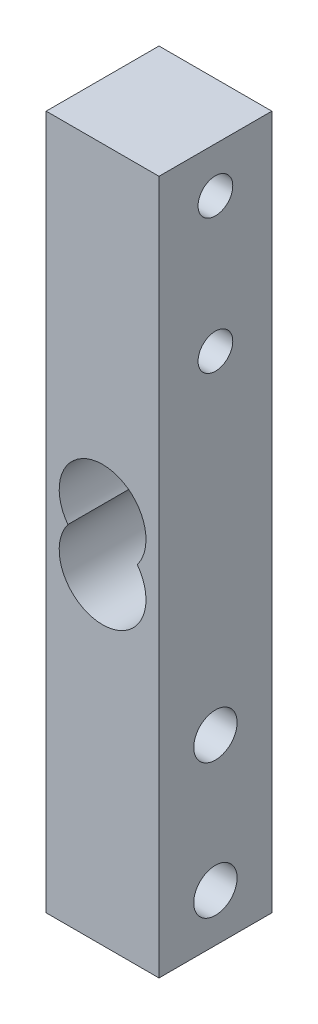
ISO-10303-21;
HEADER;
FILE_DESCRIPTION(('STEP AP214'),'2;1');
FILE_NAME('part.step','',(''),(''),'','','');
FILE_SCHEMA(('AUTOMOTIVE_DESIGN { 1 0 10303 214 1 1 1 1 }'));
ENDSEC;
DATA;
#1=APPLICATION_CONTEXT('core data for automotive mechanical design processes');
#2=APPLICATION_PROTOCOL_DEFINITION('international standard','automotive_design',2000,#1);
#3=PRODUCT_CONTEXT('',#1,'mechanical');
#4=PRODUCT('Part','Part','',(#3));
#5=PRODUCT_RELATED_PRODUCT_CATEGORY('part','',(#4));
#6=PRODUCT_DEFINITION_FORMATION('','',#4);
#7=PRODUCT_DEFINITION_CONTEXT('part definition',#1,'design');
#8=PRODUCT_DEFINITION('design','',#6,#7);
#9=PRODUCT_DEFINITION_SHAPE('','',#8);
#10=(LENGTH_UNIT() NAMED_UNIT(*) SI_UNIT(.MILLI.,.METRE.));
#11=(NAMED_UNIT(*) PLANE_ANGLE_UNIT() SI_UNIT($,.RADIAN.));
#12=(NAMED_UNIT(*) SI_UNIT($,.STERADIAN.) SOLID_ANGLE_UNIT());
#13=UNCERTAINTY_MEASURE_WITH_UNIT(LENGTH_MEASURE(1.E-05),#10,'distance_accuracy_value','');
#14=(GEOMETRIC_REPRESENTATION_CONTEXT(3) GLOBAL_UNCERTAINTY_ASSIGNED_CONTEXT((#13)) GLOBAL_UNIT_ASSIGNED_CONTEXT((#10,
#11,#12)) REPRESENTATION_CONTEXT('',''));
#15=CARTESIAN_POINT('',(0.,0.,0.));
#16=DIRECTION('',(0.,0.,1.));
#17=DIRECTION('',(1.,0.,0.));
#18=AXIS2_PLACEMENT_3D('',#15,#16,#17);
#19=CARTESIAN_POINT('',(6.5,80.,-6.5));
#20=DIRECTION('',(-1.,0.,0.));
#21=DIRECTION('',(0.,0.,1.));
#22=AXIS2_PLACEMENT_3D('',#19,#20,#21);
#23=PLANE('',#22);
#24=CARTESIAN_POINT('',(6.5,74.8,0.));
#25=DIRECTION('',(1.,0.,0.));
#26=DIRECTION('',(0.,0.,-1.));
#27=AXIS2_PLACEMENT_3D('',#24,#25,#26);
#28=CIRCLE('',#27,2.);
#29=CARTESIAN_POINT('',(6.5,74.8,-2.));
#30=VERTEX_POINT('',#29);
#31=EDGE_CURVE('E110',#30,#30,#28,.T.);
#32=ORIENTED_EDGE('',*,*,#31,.F.);
#33=EDGE_LOOP('',(#32));
#34=FACE_BOUND('',#33,.T.);
#35=CARTESIAN_POINT('',(6.5,59.3,0.));
#36=DIRECTION('',(1.,0.,0.));
#37=DIRECTION('',(0.,0.,-1.));
#38=AXIS2_PLACEMENT_3D('',#35,#36,#37);
#39=CIRCLE('',#38,2.);
#40=CARTESIAN_POINT('',(6.5,59.3,-2.));
#41=VERTEX_POINT('',#40);
#42=EDGE_CURVE('E220',#41,#41,#39,.T.);
#43=ORIENTED_EDGE('',*,*,#42,.F.);
#44=EDGE_LOOP('',(#43));
#45=FACE_BOUND('',#44,.T.);
#46=CARTESIAN_POINT('',(6.5,21.,0.));
#47=DIRECTION('',(1.,0.,0.));
#48=DIRECTION('',(0.,0.,-1.));
#49=AXIS2_PLACEMENT_3D('',#46,#47,#48);
#50=CIRCLE('',#49,2.5);
#51=CARTESIAN_POINT('',(6.5,21.,-2.50000000000001));
#52=VERTEX_POINT('',#51);
#53=EDGE_CURVE('E227',#52,#52,#50,.T.);
#54=ORIENTED_EDGE('',*,*,#53,.F.);
#55=EDGE_LOOP('',(#54));
#56=FACE_BOUND('',#55,.T.);
#57=CARTESIAN_POINT('',(6.5,5.50000000000001,0.));
#58=DIRECTION('',(1.,0.,0.));
#59=DIRECTION('',(0.,0.,-1.));
#60=AXIS2_PLACEMENT_3D('',#57,#58,#59);
#61=CIRCLE('',#60,2.5);
#62=CARTESIAN_POINT('',(6.5,5.50000000000001,-2.50000000000001));
#63=VERTEX_POINT('',#62);
#64=EDGE_CURVE('E235',#63,#63,#61,.T.);
#65=ORIENTED_EDGE('',*,*,#64,.F.);
#66=EDGE_LOOP('',(#65));
#67=FACE_BOUND('',#66,.T.);
#68=DIRECTION('',(0.,0.,-1.));
#69=VECTOR('',#68,1.);
#70=CARTESIAN_POINT('',(6.5,0.,-6.5));
#71=LINE('',#70,#69);
#72=CARTESIAN_POINT('',(6.5,0.,6.5));
#73=VERTEX_POINT('',#72);
#74=CARTESIAN_POINT('',(6.5,0.,-6.5));
#75=VERTEX_POINT('',#74);
#76=EDGE_CURVE('E120',#73,#75,#71,.T.);
#77=ORIENTED_EDGE('',*,*,#76,.T.);
#78=DIRECTION('',(0.,-1.,0.));
#79=VECTOR('',#78,1.);
#80=CARTESIAN_POINT('',(6.5,80.,-6.5));
#81=LINE('',#80,#79);
#82=CARTESIAN_POINT('',(6.5,80.,-6.5));
#83=VERTEX_POINT('',#82);
#84=EDGE_CURVE('E11',#83,#75,#81,.T.);
#85=ORIENTED_EDGE('',*,*,#84,.F.);
#86=DIRECTION('',(0.,0.,-1.));
#87=VECTOR('',#86,1.);
#88=CARTESIAN_POINT('',(6.5,80.,-6.5));
#89=LINE('',#88,#87);
#90=CARTESIAN_POINT('',(6.5,80.,6.5));
#91=VERTEX_POINT('',#90);
#92=EDGE_CURVE('E121',#91,#83,#89,.T.);
#93=ORIENTED_EDGE('',*,*,#92,.F.);
#94=DIRECTION('',(0.,-1.,0.));
#95=VECTOR('',#94,1.);
#96=CARTESIAN_POINT('',(6.5,80.,6.5));
#97=LINE('',#96,#95);
#98=EDGE_CURVE('E135',#91,#73,#97,.T.);
#99=ORIENTED_EDGE('',*,*,#98,.T.);
#100=EDGE_LOOP('',(#77,#85,#93,#99));
#101=FACE_BOUND('',#100,.T.);
#102=ADVANCED_FACE('F39',(#34,#45,#56,#67,#101),#23,.F.);
#103=CARTESIAN_POINT('',(-6.5,80.,-6.5));
#104=DIRECTION('',(0.,0.,1.));
#105=DIRECTION('',(1.,0.,0.));
#106=AXIS2_PLACEMENT_3D('',#103,#104,#105);
#107=PLANE('',#106);
#108=CARTESIAN_POINT('',(0.,37.,-6.5));
#109=DIRECTION('',(0.,0.,1.));
#110=DIRECTION('',(1.,0.,0.));
#111=AXIS2_PLACEMENT_3D('',#108,#109,#110);
#112=CIRCLE('',#111,5.);
#113=CARTESIAN_POINT('',(4.,40.,-6.5));
#114=VERTEX_POINT('',#113);
#115=CARTESIAN_POINT('',(-4.,40.,-6.5));
#116=VERTEX_POINT('',#115);
#117=EDGE_CURVE('E117',#114,#116,#112,.F.);
#118=ORIENTED_EDGE('',*,*,#117,.F.);
#119=CARTESIAN_POINT('',(0.,43.,-6.5));
#120=DIRECTION('',(0.,0.,1.));
#121=DIRECTION('',(1.,0.,0.));
#122=AXIS2_PLACEMENT_3D('',#119,#120,#121);
#123=CIRCLE('',#122,5.);
#124=EDGE_CURVE('E92',#116,#114,#123,.F.);
#125=ORIENTED_EDGE('',*,*,#124,.F.);
#126=EDGE_LOOP('',(#118,#125));
#127=FACE_BOUND('',#126,.T.);
#128=DIRECTION('',(-1.,0.,0.));
#129=VECTOR('',#128,1.);
#130=CARTESIAN_POINT('',(-6.5,0.,-6.5));
#131=LINE('',#130,#129);
#132=CARTESIAN_POINT('',(-6.5,0.,-6.5));
#133=VERTEX_POINT('',#132);
#134=EDGE_CURVE('E139',#75,#133,#131,.T.);
#135=ORIENTED_EDGE('',*,*,#134,.T.);
#136=DIRECTION('',(0.,-1.,0.));
#137=VECTOR('',#136,1.);
#138=CARTESIAN_POINT('',(-6.5,80.,-6.5));
#139=LINE('',#138,#137);
#140=CARTESIAN_POINT('',(-6.5,80.,-6.5));
#141=VERTEX_POINT('',#140);
#142=EDGE_CURVE('E47',#141,#133,#139,.T.);
#143=ORIENTED_EDGE('',*,*,#142,.F.);
#144=DIRECTION('',(-1.,0.,0.));
#145=VECTOR('',#144,1.);
#146=CARTESIAN_POINT('',(-6.5,80.,-6.5));
#147=LINE('',#146,#145);
#148=EDGE_CURVE('E125',#83,#141,#147,.T.);
#149=ORIENTED_EDGE('',*,*,#148,.F.);
#150=ORIENTED_EDGE('',*,*,#84,.T.);
#151=EDGE_LOOP('',(#135,#143,#149,#150));
#152=FACE_BOUND('',#151,.T.);
#153=ADVANCED_FACE('F173',(#127,#152),#107,.F.);
#154=CARTESIAN_POINT('',(-6.5,80.,-6.5));
#155=DIRECTION('',(1.,0.,0.));
#156=DIRECTION('',(0.,0.,-1.));
#157=AXIS2_PLACEMENT_3D('',#154,#155,#156);
#158=PLANE('',#157);
#159=CARTESIAN_POINT('',(-6.5,74.8,0.));
#160=DIRECTION('',(1.,0.,0.));
#161=DIRECTION('',(0.,0.,-1.));
#162=AXIS2_PLACEMENT_3D('',#159,#160,#161);
#163=CIRCLE('',#162,2.);
#164=CARTESIAN_POINT('',(-6.5,74.8,-2.));
#165=VERTEX_POINT('',#164);
#166=EDGE_CURVE('E106',#165,#165,#163,.F.);
#167=ORIENTED_EDGE('',*,*,#166,.F.);
#168=EDGE_LOOP('',(#167));
#169=FACE_BOUND('',#168,.T.);
#170=CARTESIAN_POINT('',(-6.5,59.3,0.));
#171=DIRECTION('',(1.,0.,0.));
#172=DIRECTION('',(0.,0.,-1.));
#173=AXIS2_PLACEMENT_3D('',#170,#171,#172);
#174=CIRCLE('',#173,2.);
#175=CARTESIAN_POINT('',(-6.5,59.3,-2.));
#176=VERTEX_POINT('',#175);
#177=EDGE_CURVE('E216',#176,#176,#174,.F.);
#178=ORIENTED_EDGE('',*,*,#177,.F.);
#179=EDGE_LOOP('',(#178));
#180=FACE_BOUND('',#179,.T.);
#181=CARTESIAN_POINT('',(-6.5,21.,0.));
#182=DIRECTION('',(1.,0.,0.));
#183=DIRECTION('',(0.,0.,-1.));
#184=AXIS2_PLACEMENT_3D('',#181,#182,#183);
#185=CIRCLE('',#184,2.5);
#186=CARTESIAN_POINT('',(-6.5,21.,-2.50000000000001));
#187=VERTEX_POINT('',#186);
#188=EDGE_CURVE('E225',#187,#187,#185,.F.);
#189=ORIENTED_EDGE('',*,*,#188,.F.);
#190=EDGE_LOOP('',(#189));
#191=FACE_BOUND('',#190,.T.);
#192=CARTESIAN_POINT('',(-6.5,5.50000000000001,0.));
#193=DIRECTION('',(1.,0.,0.));
#194=DIRECTION('',(0.,0.,-1.));
#195=AXIS2_PLACEMENT_3D('',#192,#193,#194);
#196=CIRCLE('',#195,2.5);
#197=CARTESIAN_POINT('',(-6.5,5.50000000000001,-2.50000000000001));
#198=VERTEX_POINT('',#197);
#199=EDGE_CURVE('E231',#198,#198,#196,.F.);
#200=ORIENTED_EDGE('',*,*,#199,.F.);
#201=EDGE_LOOP('',(#200));
#202=FACE_BOUND('',#201,.T.);
#203=DIRECTION('',(0.,0.,1.));
#204=VECTOR('',#203,1.);
#205=CARTESIAN_POINT('',(-6.5,0.,-6.5));
#206=LINE('',#205,#204);
#207=CARTESIAN_POINT('',(-6.5,0.,6.5));
#208=VERTEX_POINT('',#207);
#209=EDGE_CURVE('E142',#133,#208,#206,.T.);
#210=ORIENTED_EDGE('',*,*,#209,.T.);
#211=DIRECTION('',(0.,-1.,0.));
#212=VECTOR('',#211,1.);
#213=CARTESIAN_POINT('',(-6.5,80.,6.5));
#214=LINE('',#213,#212);
#215=CARTESIAN_POINT('',(-6.5,80.,6.5));
#216=VERTEX_POINT('',#215);
#217=EDGE_CURVE('E150',#216,#208,#214,.T.);
#218=ORIENTED_EDGE('',*,*,#217,.F.);
#219=DIRECTION('',(0.,0.,1.));
#220=VECTOR('',#219,1.);
#221=CARTESIAN_POINT('',(-6.5,80.,-6.5));
#222=LINE('',#221,#220);
#223=EDGE_CURVE('E129',#141,#216,#222,.T.);
#224=ORIENTED_EDGE('',*,*,#223,.F.);
#225=ORIENTED_EDGE('',*,*,#142,.T.);
#226=EDGE_LOOP('',(#210,#218,#224,#225));
#227=FACE_BOUND('',#226,.T.);
#228=ADVANCED_FACE('F159',(#169,#180,#191,#202,#227),#158,.F.);
#229=CARTESIAN_POINT('',(-6.5,80.,6.5));
#230=DIRECTION('',(0.,0.,-1.));
#231=DIRECTION('',(-1.,0.,0.));
#232=AXIS2_PLACEMENT_3D('',#229,#230,#231);
#233=PLANE('',#232);
#234=CARTESIAN_POINT('',(0.,37.,6.5));
#235=DIRECTION('',(0.,0.,1.));
#236=DIRECTION('',(1.,0.,0.));
#237=AXIS2_PLACEMENT_3D('',#234,#235,#236);
#238=CIRCLE('',#237,5.);
#239=CARTESIAN_POINT('',(-4.,40.,6.5));
#240=VERTEX_POINT('',#239);
#241=CARTESIAN_POINT('',(4.,40.,6.5));
#242=VERTEX_POINT('',#241);
#243=EDGE_CURVE('E98',#240,#242,#238,.T.);
#244=ORIENTED_EDGE('',*,*,#243,.F.);
#245=CARTESIAN_POINT('',(0.,43.,6.5));
#246=DIRECTION('',(0.,0.,1.));
#247=DIRECTION('',(1.,0.,0.));
#248=AXIS2_PLACEMENT_3D('',#245,#246,#247);
#249=CIRCLE('',#248,5.);
#250=EDGE_CURVE('E61',#242,#240,#249,.T.);
#251=ORIENTED_EDGE('',*,*,#250,.F.);
#252=EDGE_LOOP('',(#244,#251));
#253=FACE_BOUND('',#252,.T.);
#254=DIRECTION('',(1.,0.,0.));
#255=VECTOR('',#254,1.);
#256=CARTESIAN_POINT('',(-6.5,0.,6.5));
#257=LINE('',#256,#255);
#258=EDGE_CURVE('E126',#208,#73,#257,.T.);
#259=ORIENTED_EDGE('',*,*,#258,.T.);
#260=ORIENTED_EDGE('',*,*,#98,.F.);
#261=DIRECTION('',(1.,0.,0.));
#262=VECTOR('',#261,1.);
#263=CARTESIAN_POINT('',(-6.5,80.,6.5));
#264=LINE('',#263,#262);
#265=EDGE_CURVE('E132',#216,#91,#264,.T.);
#266=ORIENTED_EDGE('',*,*,#265,.F.);
#267=ORIENTED_EDGE('',*,*,#217,.T.);
#268=EDGE_LOOP('',(#259,#260,#266,#267));
#269=FACE_BOUND('',#268,.T.);
#270=ADVANCED_FACE('F103',(#253,#269),#233,.F.);
#271=CARTESIAN_POINT('',(0.,80.,0.));
#272=DIRECTION('',(0.,1.,0.));
#273=DIRECTION('',(0.,0.,1.));
#274=AXIS2_PLACEMENT_3D('',#271,#272,#273);
#275=PLANE('',#274);
#276=ORIENTED_EDGE('',*,*,#92,.T.);
#277=ORIENTED_EDGE('',*,*,#148,.T.);
#278=ORIENTED_EDGE('',*,*,#223,.T.);
#279=ORIENTED_EDGE('',*,*,#265,.T.);
#280=EDGE_LOOP('',(#276,#277,#278,#279));
#281=FACE_BOUND('',#280,.T.);
#282=ADVANCED_FACE('F172',(#281),#275,.T.);
#283=CARTESIAN_POINT('',(0.,0.,0.));
#284=DIRECTION('',(0.,1.,0.));
#285=DIRECTION('',(0.,0.,1.));
#286=AXIS2_PLACEMENT_3D('',#283,#284,#285);
#287=PLANE('',#286);
#288=ORIENTED_EDGE('',*,*,#76,.F.);
#289=ORIENTED_EDGE('',*,*,#258,.F.);
#290=ORIENTED_EDGE('',*,*,#209,.F.);
#291=ORIENTED_EDGE('',*,*,#134,.F.);
#292=EDGE_LOOP('',(#288,#289,#290,#291));
#293=FACE_BOUND('',#292,.T.);
#294=ADVANCED_FACE('F165',(#293),#287,.F.);
#295=CARTESIAN_POINT('',(0.,43.,-25.3679622641132));
#296=DIRECTION('',(0.,0.,1.));
#297=DIRECTION('',(1.,0.,0.));
#298=AXIS2_PLACEMENT_3D('',#295,#296,#297);
#299=CYLINDRICAL_SURFACE('',#298,5.);
#300=ORIENTED_EDGE('',*,*,#124,.T.);
#301=DIRECTION('',(0.,0.,1.));
#302=VECTOR('',#301,1.);
#303=CARTESIAN_POINT('',(4.,40.,-25.3679622641132));
#304=LINE('',#303,#302);
#305=EDGE_CURVE('E54',#114,#242,#304,.T.);
#306=ORIENTED_EDGE('',*,*,#305,.T.);
#307=ORIENTED_EDGE('',*,*,#250,.T.);
#308=DIRECTION('',(0.,0.,1.));
#309=VECTOR('',#308,1.);
#310=CARTESIAN_POINT('',(-4.,40.,-25.3679622641132));
#311=LINE('',#310,#309);
#312=EDGE_CURVE('E95',#116,#240,#311,.T.);
#313=ORIENTED_EDGE('',*,*,#312,.F.);
#314=EDGE_LOOP('',(#300,#306,#307,#313));
#315=FACE_BOUND('',#314,.T.);
#316=ADVANCED_FACE('F90',(#315),#299,.F.);
#317=CARTESIAN_POINT('',(0.,37.,-25.3679622641132));
#318=DIRECTION('',(0.,0.,1.));
#319=DIRECTION('',(1.,0.,0.));
#320=AXIS2_PLACEMENT_3D('',#317,#318,#319);
#321=CYLINDRICAL_SURFACE('',#320,5.);
#322=ORIENTED_EDGE('',*,*,#117,.T.);
#323=ORIENTED_EDGE('',*,*,#312,.T.);
#324=ORIENTED_EDGE('',*,*,#243,.T.);
#325=ORIENTED_EDGE('',*,*,#305,.F.);
#326=EDGE_LOOP('',(#322,#323,#324,#325));
#327=FACE_BOUND('',#326,.T.);
#328=ADVANCED_FACE('F99',(#327),#321,.F.);
#329=CARTESIAN_POINT('',(-13.5710678118655,5.50000000000001,0.));
#330=DIRECTION('',(1.,0.,0.));
#331=DIRECTION('',(0.,0.,-1.));
#332=AXIS2_PLACEMENT_3D('',#329,#330,#331);
#333=CYLINDRICAL_SURFACE('',#332,2.5);
#334=ORIENTED_EDGE('',*,*,#199,.T.);
#335=EDGE_LOOP('',(#334));
#336=FACE_BOUND('',#335,.T.);
#337=ORIENTED_EDGE('',*,*,#64,.T.);
#338=EDGE_LOOP('',(#337));
#339=FACE_BOUND('',#338,.T.);
#340=ADVANCED_FACE('F194',(#336,#339),#333,.F.);
#341=CARTESIAN_POINT('',(-13.5710678118655,21.,0.));
#342=DIRECTION('',(1.,0.,0.));
#343=DIRECTION('',(0.,0.,-1.));
#344=AXIS2_PLACEMENT_3D('',#341,#342,#343);
#345=CYLINDRICAL_SURFACE('',#344,2.5);
#346=ORIENTED_EDGE('',*,*,#188,.T.);
#347=EDGE_LOOP('',(#346));
#348=FACE_BOUND('',#347,.T.);
#349=ORIENTED_EDGE('',*,*,#53,.T.);
#350=EDGE_LOOP('',(#349));
#351=FACE_BOUND('',#350,.T.);
#352=ADVANCED_FACE('F197',(#348,#351),#345,.F.);
#353=CARTESIAN_POINT('',(-13.5710678118655,59.3,0.));
#354=DIRECTION('',(1.,0.,0.));
#355=DIRECTION('',(0.,0.,-1.));
#356=AXIS2_PLACEMENT_3D('',#353,#354,#355);
#357=CYLINDRICAL_SURFACE('',#356,2.);
#358=ORIENTED_EDGE('',*,*,#177,.T.);
#359=EDGE_LOOP('',(#358));
#360=FACE_BOUND('',#359,.T.);
#361=ORIENTED_EDGE('',*,*,#42,.T.);
#362=EDGE_LOOP('',(#361));
#363=FACE_BOUND('',#362,.T.);
#364=ADVANCED_FACE('F201',(#360,#363),#357,.F.);
#365=CARTESIAN_POINT('',(-13.5710678118655,74.8,0.));
#366=DIRECTION('',(1.,0.,0.));
#367=DIRECTION('',(0.,0.,-1.));
#368=AXIS2_PLACEMENT_3D('',#365,#366,#367);
#369=CYLINDRICAL_SURFACE('',#368,2.);
#370=ORIENTED_EDGE('',*,*,#166,.T.);
#371=EDGE_LOOP('',(#370));
#372=FACE_BOUND('',#371,.T.);
#373=ORIENTED_EDGE('',*,*,#31,.T.);
#374=EDGE_LOOP('',(#373));
#375=FACE_BOUND('',#374,.T.);
#376=ADVANCED_FACE('F205',(#372,#375),#369,.F.);
#377=CLOSED_SHELL('',(#102,#153,#228,#270,#282,#294,#316,#328,#340,#352,#364,#376));
#378=MANIFOLD_SOLID_BREP('B2',#377);
#379=ADVANCED_BREP_SHAPE_REPRESENTATION('',(#18,#378),#14);
#380=SHAPE_DEFINITION_REPRESENTATION(#9,#379);
ENDSEC;
END-ISO-10303-21;
